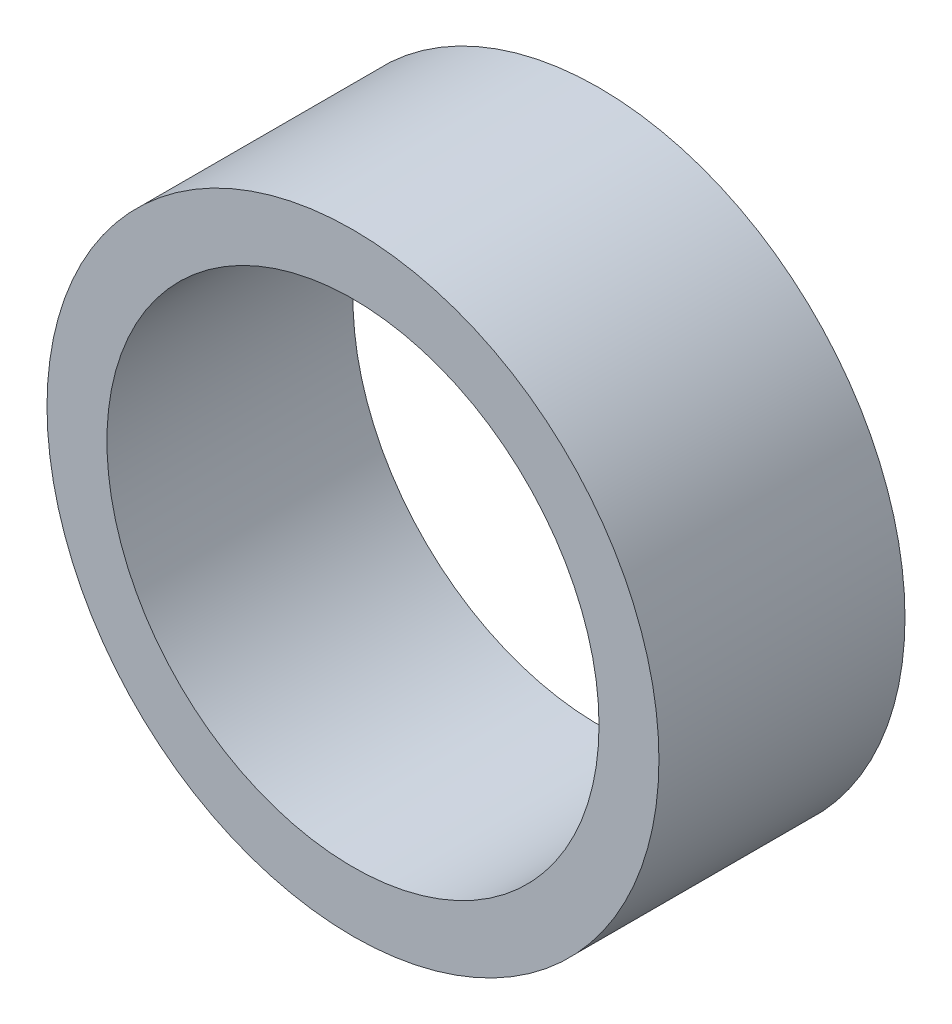
ISO-10303-21;
HEADER;
FILE_DESCRIPTION(('STEP AP214'),'2;1');
FILE_NAME('part.step','',(''),(''),'','','');
FILE_SCHEMA(('AUTOMOTIVE_DESIGN { 1 0 10303 214 1 1 1 1 }'));
ENDSEC;
DATA;
#1=APPLICATION_CONTEXT('core data for automotive mechanical design processes');
#2=APPLICATION_PROTOCOL_DEFINITION('international standard','automotive_design',2000,#1);
#3=PRODUCT_CONTEXT('',#1,'mechanical');
#4=PRODUCT('Part','Part','',(#3));
#5=PRODUCT_RELATED_PRODUCT_CATEGORY('part','',(#4));
#6=PRODUCT_DEFINITION_FORMATION('','',#4);
#7=PRODUCT_DEFINITION_CONTEXT('part definition',#1,'design');
#8=PRODUCT_DEFINITION('design','',#6,#7);
#9=PRODUCT_DEFINITION_SHAPE('','',#8);
#10=(LENGTH_UNIT() NAMED_UNIT(*) SI_UNIT(.MILLI.,.METRE.));
#11=(NAMED_UNIT(*) PLANE_ANGLE_UNIT() SI_UNIT($,.RADIAN.));
#12=(NAMED_UNIT(*) SI_UNIT($,.STERADIAN.) SOLID_ANGLE_UNIT());
#13=UNCERTAINTY_MEASURE_WITH_UNIT(LENGTH_MEASURE(1.E-05),#10,'distance_accuracy_value','');
#14=(GEOMETRIC_REPRESENTATION_CONTEXT(3) GLOBAL_UNCERTAINTY_ASSIGNED_CONTEXT((#13)) GLOBAL_UNIT_ASSIGNED_CONTEXT((#10,
#11,#12)) REPRESENTATION_CONTEXT('',''));
#15=CARTESIAN_POINT('',(0.,0.,0.));
#16=DIRECTION('',(0.,0.,1.));
#17=DIRECTION('',(1.,0.,0.));
#18=AXIS2_PLACEMENT_3D('',#15,#16,#17);
#19=CARTESIAN_POINT('',(0.,0.,20.));
#20=DIRECTION('',(0.,0.,1.));
#21=DIRECTION('',(1.,0.,0.));
#22=AXIS2_PLACEMENT_3D('',#19,#20,#21);
#23=PLANE('',#22);
#24=CARTESIAN_POINT('',(0.,0.,20.));
#25=DIRECTION('',(0.,0.,1.));
#26=DIRECTION('',(1.,0.,0.));
#27=AXIS2_PLACEMENT_3D('',#24,#25,#26);
#28=CIRCLE('',#27,24.87);
#29=CARTESIAN_POINT('',(24.87,0.,20.));
#30=VERTEX_POINT('',#29);
#31=EDGE_CURVE('E10',#30,#30,#28,.T.);
#32=ORIENTED_EDGE('',*,*,#31,.T.);
#33=EDGE_LOOP('',(#32));
#34=FACE_BOUND('',#33,.T.);
#35=CARTESIAN_POINT('',(0.,0.,20.));
#36=DIRECTION('',(0.,0.,1.));
#37=DIRECTION('',(1.,0.,0.));
#38=AXIS2_PLACEMENT_3D('',#35,#36,#37);
#39=CIRCLE('',#38,20.);
#40=CARTESIAN_POINT('',(20.,0.,20.));
#41=VERTEX_POINT('',#40);
#42=EDGE_CURVE('E42',#41,#41,#39,.T.);
#43=ORIENTED_EDGE('',*,*,#42,.F.);
#44=EDGE_LOOP('',(#43));
#45=FACE_BOUND('',#44,.T.);
#46=ADVANCED_FACE('F31',(#34,#45),#23,.T.);
#47=CARTESIAN_POINT('',(0.,0.,0.));
#48=DIRECTION('',(0.,0.,1.));
#49=DIRECTION('',(1.,0.,0.));
#50=AXIS2_PLACEMENT_3D('',#47,#48,#49);
#51=PLANE('',#50);
#52=CARTESIAN_POINT('',(0.,0.,0.));
#53=DIRECTION('',(0.,0.,1.));
#54=DIRECTION('',(1.,0.,0.));
#55=AXIS2_PLACEMENT_3D('',#52,#53,#54);
#56=CIRCLE('',#55,24.87);
#57=CARTESIAN_POINT('',(24.87,0.,0.));
#58=VERTEX_POINT('',#57);
#59=EDGE_CURVE('E35',#58,#58,#56,.T.);
#60=ORIENTED_EDGE('',*,*,#59,.F.);
#61=EDGE_LOOP('',(#60));
#62=FACE_BOUND('',#61,.T.);
#63=CARTESIAN_POINT('',(0.,0.,0.));
#64=DIRECTION('',(0.,0.,1.));
#65=DIRECTION('',(1.,0.,0.));
#66=AXIS2_PLACEMENT_3D('',#63,#64,#65);
#67=CIRCLE('',#66,20.);
#68=CARTESIAN_POINT('',(20.,0.,0.));
#69=VERTEX_POINT('',#68);
#70=EDGE_CURVE('E44',#69,#69,#67,.T.);
#71=ORIENTED_EDGE('',*,*,#70,.T.);
#72=EDGE_LOOP('',(#71));
#73=FACE_BOUND('',#72,.T.);
#74=ADVANCED_FACE('F54',(#62,#73),#51,.F.);
#75=CARTESIAN_POINT('',(0.,0.,20.));
#76=DIRECTION('',(0.,0.,-1.));
#77=DIRECTION('',(-1.,0.,0.));
#78=AXIS2_PLACEMENT_3D('',#75,#76,#77);
#79=CYLINDRICAL_SURFACE('',#78,24.87);
#80=ORIENTED_EDGE('',*,*,#31,.F.);
#81=EDGE_LOOP('',(#80));
#82=FACE_BOUND('',#81,.T.);
#83=ORIENTED_EDGE('',*,*,#59,.T.);
#84=EDGE_LOOP('',(#83));
#85=FACE_BOUND('',#84,.T.);
#86=ADVANCED_FACE('F33',(#82,#85),#79,.T.);
#87=CARTESIAN_POINT('',(0.,0.,20.));
#88=DIRECTION('',(0.,0.,-1.));
#89=DIRECTION('',(-1.,0.,0.));
#90=AXIS2_PLACEMENT_3D('',#87,#88,#89);
#91=CYLINDRICAL_SURFACE('',#90,20.);
#92=ORIENTED_EDGE('',*,*,#42,.T.);
#93=EDGE_LOOP('',(#92));
#94=FACE_BOUND('',#93,.T.);
#95=ORIENTED_EDGE('',*,*,#70,.F.);
#96=EDGE_LOOP('',(#95));
#97=FACE_BOUND('',#96,.T.);
#98=ADVANCED_FACE('F50',(#94,#97),#91,.F.);
#99=CLOSED_SHELL('',(#46,#74,#86,#98));
#100=MANIFOLD_SOLID_BREP('B2',#99);
#101=ADVANCED_BREP_SHAPE_REPRESENTATION('',(#18,#100),#14);
#102=SHAPE_DEFINITION_REPRESENTATION(#9,#101);
ENDSEC;
END-ISO-10303-21;
